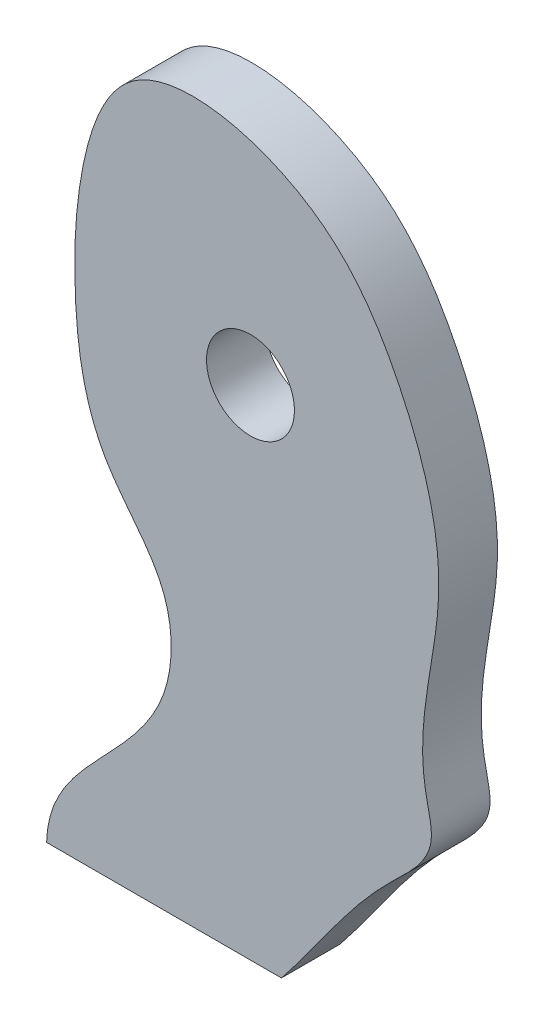
ISO-10303-21;
HEADER;
FILE_DESCRIPTION(('STEP AP214'),'2;1');
FILE_NAME('part.step','',(''),(''),'','','');
FILE_SCHEMA(('AUTOMOTIVE_DESIGN { 1 0 10303 214 1 1 1 1 }'));
ENDSEC;
DATA;
#1=APPLICATION_CONTEXT('core data for automotive mechanical design processes');
#2=APPLICATION_PROTOCOL_DEFINITION('international standard','automotive_design',2000,#1);
#3=PRODUCT_CONTEXT('',#1,'mechanical');
#4=PRODUCT('Part','Part','',(#3));
#5=PRODUCT_RELATED_PRODUCT_CATEGORY('part','',(#4));
#6=PRODUCT_DEFINITION_FORMATION('','',#4);
#7=PRODUCT_DEFINITION_CONTEXT('part definition',#1,'design');
#8=PRODUCT_DEFINITION('design','',#6,#7);
#9=PRODUCT_DEFINITION_SHAPE('','',#8);
#10=(LENGTH_UNIT() NAMED_UNIT(*) SI_UNIT(.MILLI.,.METRE.));
#11=(NAMED_UNIT(*) PLANE_ANGLE_UNIT() SI_UNIT($,.RADIAN.));
#12=(NAMED_UNIT(*) SI_UNIT($,.STERADIAN.) SOLID_ANGLE_UNIT());
#13=UNCERTAINTY_MEASURE_WITH_UNIT(LENGTH_MEASURE(1.E-05),#10,'distance_accuracy_value','');
#14=(GEOMETRIC_REPRESENTATION_CONTEXT(3) GLOBAL_UNCERTAINTY_ASSIGNED_CONTEXT((#13)) GLOBAL_UNIT_ASSIGNED_CONTEXT((#10,
#11,#12)) REPRESENTATION_CONTEXT('',''));
#15=CARTESIAN_POINT('',(0.,0.,0.));
#16=DIRECTION('',(0.,0.,1.));
#17=DIRECTION('',(1.,0.,0.));
#18=AXIS2_PLACEMENT_3D('',#15,#16,#17);
#19=CARTESIAN_POINT('',(128.205508562195,73.0164279866577,3.175));
#20=DIRECTION('',(0.,0.,1.));
#21=DIRECTION('',(1.,0.,0.));
#22=AXIS2_PLACEMENT_3D('',#19,#20,#21);
#23=PLANE('',#22);
#24=CARTESIAN_POINT('',(131.678974086136,34.1672123866147,3.175));
#25=CARTESIAN_POINT('',(133.729735142448,36.7141939588897,3.175));
#26=CARTESIAN_POINT('',(135.714079048114,40.1856324662144,3.175));
#27=CARTESIAN_POINT('',(140.262700774617,43.9947340216254,3.175));
#28=CARTESIAN_POINT('',(138.587636306226,49.4278679980297,3.175));
#29=CARTESIAN_POINT('',(141.33822211105,56.3814008193325,3.175));
#30=CARTESIAN_POINT('',(138.493639110666,65.1338380743868,3.175));
#31=CARTESIAN_POINT('',(133.64845235459,72.2218371101032,3.175));
#32=CARTESIAN_POINT('',(123.016973290857,74.7228192284044,3.175));
#33=CARTESIAN_POINT('',(120.600714524329,66.4838857909946,3.175));
#34=CARTESIAN_POINT('',(120.367535927239,60.3341219710335,3.175));
#35=CARTESIAN_POINT('',(121.127487030637,53.8812689741059,3.175));
#36=CARTESIAN_POINT('',(125.891543854835,49.657029521493,3.175));
#37=CARTESIAN_POINT('',(125.793601399323,43.7985639930937,3.175));
#38=CARTESIAN_POINT('',(121.906398461001,39.5446952372543,3.175));
#39=CARTESIAN_POINT('',(119.030334903202,36.6469814923889,3.175));
#40=CARTESIAN_POINT('',(118.967121115827,34.1672123866147,3.175));
#41=B_SPLINE_CURVE_WITH_KNOTS('',3,(#24,#25,#26,#27,#28,#29,#30,#31,#32,#33,#34,#35,#36,#37,#38,
#39,#40),.UNSPECIFIED.,.F.,.F.,(4,1,1,1,1,1,1,1,1,1,1,1,1,1,4),(0.,0.101478733485897,
0.142291879114129,0.164995856740406,0.271782467203194,0.371132727161998,0.444709671799783,
0.552084874337409,0.624598668288764,0.677195568568816,0.758725285120832,0.819894425845818,
0.869405021221026,0.928095196028425,1.),.UNSPECIFIED.);
#42=CARTESIAN_POINT('',(131.678974086136,34.1672123866147,3.175));
#43=VERTEX_POINT('',#42);
#44=CARTESIAN_POINT('',(118.967121115827,34.1672123866147,3.175));
#45=VERTEX_POINT('',#44);
#46=EDGE_CURVE('E65',#43,#45,#41,.T.);
#47=ORIENTED_EDGE('',*,*,#46,.T.);
#48=DIRECTION('',(1.,0.,0.));
#49=VECTOR('',#48,1.);
#50=CARTESIAN_POINT('',(118.967121115827,34.1672123866147,3.175));
#51=LINE('',#50,#49);
#52=EDGE_CURVE('E50',#45,#43,#51,.T.);
#53=ORIENTED_EDGE('',*,*,#52,.T.);
#54=EDGE_LOOP('',(#47,#53));
#55=FACE_BOUND('',#54,.T.);
#56=CARTESIAN_POINT('',(130.002685782359,61.1275159390282,3.175));
#57=DIRECTION('',(0.,0.,1.));
#58=DIRECTION('',(1.,0.,0.));
#59=AXIS2_PLACEMENT_3D('',#56,#57,#58);
#60=CIRCLE('',#59,2.38125);
#61=CARTESIAN_POINT('',(132.383935782359,61.1275159390282,3.175));
#62=VERTEX_POINT('',#61);
#63=EDGE_CURVE('E71',#62,#62,#60,.T.);
#64=ORIENTED_EDGE('',*,*,#63,.F.);
#65=EDGE_LOOP('',(#64));
#66=FACE_BOUND('',#65,.T.);
#67=ADVANCED_FACE('F33',(#55,#66),#23,.T.);
#68=CARTESIAN_POINT('',(128.205508562195,73.0164279866577,0.));
#69=DIRECTION('',(0.,0.,1.));
#70=DIRECTION('',(1.,0.,0.));
#71=AXIS2_PLACEMENT_3D('',#68,#69,#70);
#72=PLANE('',#71);
#73=CARTESIAN_POINT('',(131.678974086136,34.1672123866147,0.));
#74=CARTESIAN_POINT('',(133.729735142448,36.7141939588897,0.));
#75=CARTESIAN_POINT('',(135.714079048114,40.1856324662144,0.));
#76=CARTESIAN_POINT('',(140.262700774617,43.9947340216254,0.));
#77=CARTESIAN_POINT('',(138.587636306226,49.4278679980297,0.));
#78=CARTESIAN_POINT('',(141.33822211105,56.3814008193325,0.));
#79=CARTESIAN_POINT('',(138.493639110666,65.1338380743868,0.));
#80=CARTESIAN_POINT('',(133.64845235459,72.2218371101032,0.));
#81=CARTESIAN_POINT('',(123.016973290857,74.7228192284044,0.));
#82=CARTESIAN_POINT('',(120.600714524329,66.4838857909946,0.));
#83=CARTESIAN_POINT('',(120.367535927239,60.3341219710335,0.));
#84=CARTESIAN_POINT('',(121.127487030637,53.8812689741059,0.));
#85=CARTESIAN_POINT('',(125.891543854835,49.657029521493,0.));
#86=CARTESIAN_POINT('',(125.793601399323,43.7985639930937,0.));
#87=CARTESIAN_POINT('',(121.906398461001,39.5446952372543,0.));
#88=CARTESIAN_POINT('',(119.030334903202,36.6469814923889,0.));
#89=CARTESIAN_POINT('',(118.967121115827,34.1672123866147,0.));
#90=B_SPLINE_CURVE_WITH_KNOTS('',3,(#73,#74,#75,#76,#77,#78,#79,#80,#81,#82,#83,#84,#85,#86,#87,
#88,#89),.UNSPECIFIED.,.F.,.F.,(4,1,1,1,1,1,1,1,1,1,1,1,1,1,4),(0.,0.101478733485897,
0.142291879114129,0.164995856740406,0.271782467203194,0.371132727161998,0.444709671799783,
0.552084874337409,0.624598668288764,0.677195568568816,0.758725285120832,0.819894425845818,
0.869405021221026,0.928095196028425,1.),.UNSPECIFIED.);
#91=CARTESIAN_POINT('',(131.678974086136,34.1672123866147,0.));
#92=VERTEX_POINT('',#91);
#93=CARTESIAN_POINT('',(118.967121115827,34.1672123866147,0.));
#94=VERTEX_POINT('',#93);
#95=EDGE_CURVE('E66',#92,#94,#90,.T.);
#96=ORIENTED_EDGE('',*,*,#95,.F.);
#97=DIRECTION('',(1.,0.,0.));
#98=VECTOR('',#97,1.);
#99=CARTESIAN_POINT('',(118.967121115827,34.1672123866147,0.));
#100=LINE('',#99,#98);
#101=EDGE_CURVE('E58',#94,#92,#100,.T.);
#102=ORIENTED_EDGE('',*,*,#101,.F.);
#103=EDGE_LOOP('',(#96,#102));
#104=FACE_BOUND('',#103,.T.);
#105=CARTESIAN_POINT('',(130.002685782359,61.1275159390282,0.));
#106=DIRECTION('',(0.,0.,1.));
#107=DIRECTION('',(1.,0.,0.));
#108=AXIS2_PLACEMENT_3D('',#105,#106,#107);
#109=CIRCLE('',#108,2.38125);
#110=CARTESIAN_POINT('',(132.383935782359,61.1275159390282,0.));
#111=VERTEX_POINT('',#110);
#112=EDGE_CURVE('E74',#111,#111,#109,.T.);
#113=ORIENTED_EDGE('',*,*,#112,.T.);
#114=EDGE_LOOP('',(#113));
#115=FACE_BOUND('',#114,.T.);
#116=ADVANCED_FACE('F69',(#104,#115),#72,.F.);
#117=DIRECTION('',(0.,0.,-1.));
#118=VECTOR('',#117,1.);
#119=SURFACE_OF_LINEAR_EXTRUSION('',#41,#118);
#120=ORIENTED_EDGE('',*,*,#95,.T.);
#121=DIRECTION('',(0.,0.,-1.));
#122=VECTOR('',#121,1.);
#123=CARTESIAN_POINT('',(118.967121115827,34.1672123866147,3.175));
#124=LINE('',#123,#122);
#125=EDGE_CURVE('E11',#45,#94,#124,.T.);
#126=ORIENTED_EDGE('',*,*,#125,.F.);
#127=ORIENTED_EDGE('',*,*,#46,.F.);
#128=DIRECTION('',(0.,0.,-1.));
#129=VECTOR('',#128,1.);
#130=CARTESIAN_POINT('',(131.678974086136,34.1672123866147,3.175));
#131=LINE('',#130,#129);
#132=EDGE_CURVE('E43',#43,#92,#131,.T.);
#133=ORIENTED_EDGE('',*,*,#132,.T.);
#134=EDGE_LOOP('',(#120,#126,#127,#133));
#135=FACE_BOUND('',#134,.T.);
#136=ADVANCED_FACE('F35',(#135),#119,.F.);
#137=CARTESIAN_POINT('',(118.967121115827,34.1672123866147,3.175));
#138=DIRECTION('',(0.,1.,0.));
#139=DIRECTION('',(0.,0.,1.));
#140=AXIS2_PLACEMENT_3D('',#137,#138,#139);
#141=PLANE('',#140);
#142=ORIENTED_EDGE('',*,*,#101,.T.);
#143=ORIENTED_EDGE('',*,*,#132,.F.);
#144=ORIENTED_EDGE('',*,*,#52,.F.);
#145=ORIENTED_EDGE('',*,*,#125,.T.);
#146=EDGE_LOOP('',(#142,#143,#144,#145));
#147=FACE_BOUND('',#146,.T.);
#148=ADVANCED_FACE('F61',(#147),#141,.F.);
#149=CARTESIAN_POINT('',(130.002685782359,61.1275159390282,3.175));
#150=DIRECTION('',(0.,0.,-1.));
#151=DIRECTION('',(-1.,0.,0.));
#152=AXIS2_PLACEMENT_3D('',#149,#150,#151);
#153=CYLINDRICAL_SURFACE('',#152,2.38125);
#154=ORIENTED_EDGE('',*,*,#63,.T.);
#155=EDGE_LOOP('',(#154));
#156=FACE_BOUND('',#155,.T.);
#157=ORIENTED_EDGE('',*,*,#112,.F.);
#158=EDGE_LOOP('',(#157));
#159=FACE_BOUND('',#158,.T.);
#160=ADVANCED_FACE('F92',(#156,#159),#153,.F.);
#161=CLOSED_SHELL('',(#67,#116,#136,#148,#160));
#162=MANIFOLD_SOLID_BREP('B2',#161);
#163=ADVANCED_BREP_SHAPE_REPRESENTATION('',(#18,#162),#14);
#164=SHAPE_DEFINITION_REPRESENTATION(#9,#163);
ENDSEC;
END-ISO-10303-21;
